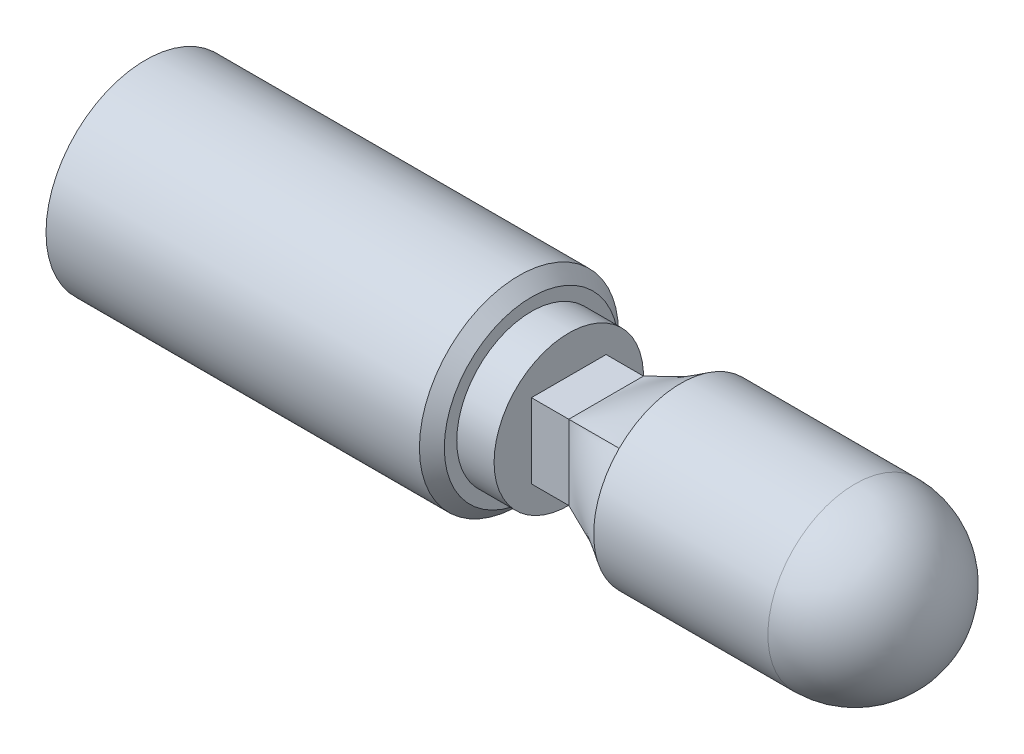
ISO-10303-21;
HEADER;
FILE_DESCRIPTION(('STEP AP214'),'2;1');
FILE_NAME('part.step','',(''),(''),'','','');
FILE_SCHEMA(('AUTOMOTIVE_DESIGN { 1 0 10303 214 1 1 1 1 }'));
ENDSEC;
DATA;
#1=APPLICATION_CONTEXT('core data for automotive mechanical design processes');
#2=APPLICATION_PROTOCOL_DEFINITION('international standard','automotive_design',2000,#1);
#3=PRODUCT_CONTEXT('',#1,'mechanical');
#4=PRODUCT('Part','Part','',(#3));
#5=PRODUCT_RELATED_PRODUCT_CATEGORY('part','',(#4));
#6=PRODUCT_DEFINITION_FORMATION('','',#4);
#7=PRODUCT_DEFINITION_CONTEXT('part definition',#1,'design');
#8=PRODUCT_DEFINITION('design','',#6,#7);
#9=PRODUCT_DEFINITION_SHAPE('','',#8);
#10=(LENGTH_UNIT() NAMED_UNIT(*) SI_UNIT(.MILLI.,.METRE.));
#11=(NAMED_UNIT(*) PLANE_ANGLE_UNIT() SI_UNIT($,.RADIAN.));
#12=(NAMED_UNIT(*) SI_UNIT($,.STERADIAN.) SOLID_ANGLE_UNIT());
#13=UNCERTAINTY_MEASURE_WITH_UNIT(LENGTH_MEASURE(1.E-05),#10,'distance_accuracy_value','');
#14=(GEOMETRIC_REPRESENTATION_CONTEXT(3) GLOBAL_UNCERTAINTY_ASSIGNED_CONTEXT((#13)) GLOBAL_UNIT_ASSIGNED_CONTEXT((#10,
#11,#12)) REPRESENTATION_CONTEXT('',''));
#15=CARTESIAN_POINT('',(0.,0.,0.));
#16=DIRECTION('',(0.,0.,1.));
#17=DIRECTION('',(1.,0.,0.));
#18=AXIS2_PLACEMENT_3D('',#15,#16,#17);
#19=CARTESIAN_POINT('',(34.,0.,0.));
#20=DIRECTION('',(-1.,0.,0.));
#21=DIRECTION('',(0.,0.,1.));
#22=AXIS2_PLACEMENT_3D('',#19,#20,#21);
#23=PLANE('',#22);
#24=CARTESIAN_POINT('',(34.,0.,0.));
#25=DIRECTION('',(-1.,0.,0.));
#26=DIRECTION('',(0.,0.,1.));
#27=AXIS2_PLACEMENT_3D('',#24,#25,#26);
#28=CIRCLE('',#27,6.);
#29=CARTESIAN_POINT('',(34.,0.,6.));
#30=VERTEX_POINT('',#29);
#31=EDGE_CURVE('E119',#30,#30,#28,.T.);
#32=ORIENTED_EDGE('',*,*,#31,.F.);
#33=EDGE_LOOP('',(#32));
#34=FACE_BOUND('',#33,.T.);
#35=DIRECTION('',(0.,1.,0.));
#36=VECTOR('',#35,1.);
#37=CARTESIAN_POINT('',(34.,-3.,-3.));
#38=LINE('',#37,#36);
#39=CARTESIAN_POINT('',(34.,-3.,-3.));
#40=VERTEX_POINT('',#39);
#41=CARTESIAN_POINT('',(34.,3.,-3.));
#42=VERTEX_POINT('',#41);
#43=EDGE_CURVE('E84',#40,#42,#38,.T.);
#44=ORIENTED_EDGE('',*,*,#43,.F.);
#45=DIRECTION('',(0.,0.,-1.));
#46=VECTOR('',#45,1.);
#47=CARTESIAN_POINT('',(34.,-3.,3.));
#48=LINE('',#47,#46);
#49=CARTESIAN_POINT('',(34.,-3.,3.));
#50=VERTEX_POINT('',#49);
#51=EDGE_CURVE('E138',#50,#40,#48,.T.);
#52=ORIENTED_EDGE('',*,*,#51,.F.);
#53=DIRECTION('',(0.,-1.,0.));
#54=VECTOR('',#53,1.);
#55=CARTESIAN_POINT('',(34.,-3.,3.));
#56=LINE('',#55,#54);
#57=CARTESIAN_POINT('',(34.,3.,3.));
#58=VERTEX_POINT('',#57);
#59=EDGE_CURVE('E108',#58,#50,#56,.T.);
#60=ORIENTED_EDGE('',*,*,#59,.F.);
#61=DIRECTION('',(0.,0.,1.));
#62=VECTOR('',#61,1.);
#63=CARTESIAN_POINT('',(34.,3.,3.));
#64=LINE('',#63,#62);
#65=EDGE_CURVE('E112',#42,#58,#64,.T.);
#66=ORIENTED_EDGE('',*,*,#65,.F.);
#67=EDGE_LOOP('',(#44,#52,#60,#66));
#68=FACE_BOUND('',#67,.T.);
#69=ADVANCED_FACE('F66',(#34,#68),#23,.F.);
#70=CARTESIAN_POINT('',(0.,0.,0.));
#71=DIRECTION('',(1.,0.,0.));
#72=DIRECTION('',(0.,0.,-1.));
#73=AXIS2_PLACEMENT_3D('',#70,#71,#72);
#74=PLANE('',#73);
#75=CARTESIAN_POINT('',(0.,0.,0.));
#76=DIRECTION('',(-1.,0.,0.));
#77=DIRECTION('',(0.,0.,1.));
#78=AXIS2_PLACEMENT_3D('',#75,#76,#77);
#79=CIRCLE('',#78,1.6);
#80=CARTESIAN_POINT('',(0.,0.,1.6));
#81=VERTEX_POINT('',#80);
#82=EDGE_CURVE('E464',#81,#81,#79,.T.);
#83=ORIENTED_EDGE('',*,*,#82,.F.);
#84=EDGE_LOOP('',(#83));
#85=FACE_BOUND('',#84,.T.);
#86=CARTESIAN_POINT('',(0.,0.,0.));
#87=DIRECTION('',(-1.,0.,0.));
#88=DIRECTION('',(0.,0.,1.));
#89=AXIS2_PLACEMENT_3D('',#86,#87,#88);
#90=CIRCLE('',#89,8.);
#91=CARTESIAN_POINT('',(0.,0.,8.));
#92=VERTEX_POINT('',#91);
#93=EDGE_CURVE('E146',#92,#92,#90,.T.);
#94=ORIENTED_EDGE('',*,*,#93,.T.);
#95=EDGE_LOOP('',(#94));
#96=FACE_BOUND('',#95,.T.);
#97=ADVANCED_FACE('F202',(#85,#96),#74,.F.);
#98=CARTESIAN_POINT('',(0.,0.,0.));
#99=DIRECTION('',(-1.,0.,0.));
#100=DIRECTION('',(0.,0.,1.));
#101=AXIS2_PLACEMENT_3D('',#98,#99,#100);
#102=CYLINDRICAL_SURFACE('',#101,8.);
#103=CARTESIAN_POINT('',(30.,0.,0.));
#104=DIRECTION('',(-1.,0.,0.));
#105=DIRECTION('',(0.,0.,1.));
#106=AXIS2_PLACEMENT_3D('',#103,#104,#105);
#107=CIRCLE('',#106,8.);
#108=CARTESIAN_POINT('',(30.,0.,8.));
#109=VERTEX_POINT('',#108);
#110=EDGE_CURVE('E76',#109,#109,#107,.T.);
#111=ORIENTED_EDGE('',*,*,#110,.T.);
#112=EDGE_LOOP('',(#111));
#113=FACE_BOUND('',#112,.T.);
#114=ORIENTED_EDGE('',*,*,#93,.F.);
#115=EDGE_LOOP('',(#114));
#116=FACE_BOUND('',#115,.T.);
#117=ADVANCED_FACE('F188',(#113,#116),#102,.T.);
#118=CARTESIAN_POINT('',(31.,8.,0.));
#119=DIRECTION('',(-1.,0.,0.));
#120=DIRECTION('',(0.,0.,1.));
#121=AXIS2_PLACEMENT_3D('',#118,#119,#120);
#122=PLANE('',#121);
#123=CARTESIAN_POINT('',(31.,0.,0.));
#124=DIRECTION('',(-1.,0.,0.));
#125=DIRECTION('',(0.,0.,1.));
#126=AXIS2_PLACEMENT_3D('',#123,#124,#125);
#127=CIRCLE('',#126,7.);
#128=CARTESIAN_POINT('',(31.,0.,7.));
#129=VERTEX_POINT('',#128);
#130=EDGE_CURVE('E12',#129,#129,#127,.F.);
#131=ORIENTED_EDGE('',*,*,#130,.T.);
#132=EDGE_LOOP('',(#131));
#133=FACE_BOUND('',#132,.T.);
#134=CARTESIAN_POINT('',(31.,0.,0.));
#135=DIRECTION('',(-1.,0.,0.));
#136=DIRECTION('',(0.,0.,1.));
#137=AXIS2_PLACEMENT_3D('',#134,#135,#136);
#138=CIRCLE('',#137,6.);
#139=CARTESIAN_POINT('',(31.,0.,6.));
#140=VERTEX_POINT('',#139);
#141=EDGE_CURVE('E143',#140,#140,#138,.T.);
#142=ORIENTED_EDGE('',*,*,#141,.T.);
#143=EDGE_LOOP('',(#142));
#144=FACE_BOUND('',#143,.T.);
#145=ADVANCED_FACE('F216',(#133,#144),#122,.F.);
#146=CARTESIAN_POINT('',(0.,0.,0.));
#147=DIRECTION('',(-1.,0.,0.));
#148=DIRECTION('',(0.,0.,1.));
#149=AXIS2_PLACEMENT_3D('',#146,#147,#148);
#150=CYLINDRICAL_SURFACE('',#149,6.);
#151=ORIENTED_EDGE('',*,*,#141,.F.);
#152=EDGE_LOOP('',(#151));
#153=FACE_BOUND('',#152,.T.);
#154=ORIENTED_EDGE('',*,*,#31,.T.);
#155=EDGE_LOOP('',(#154));
#156=FACE_BOUND('',#155,.T.);
#157=ADVANCED_FACE('F213',(#153,#156),#150,.T.);
#158=CARTESIAN_POINT('',(37.,-3.,-3.));
#159=DIRECTION('',(0.,0.,1.));
#160=DIRECTION('',(1.,0.,0.));
#161=AXIS2_PLACEMENT_3D('',#158,#159,#160);
#162=PLANE('',#161);
#163=ORIENTED_EDGE('',*,*,#43,.T.);
#164=DIRECTION('',(-1.,0.,0.));
#165=VECTOR('',#164,1.);
#166=CARTESIAN_POINT('',(37.,3.,-3.));
#167=LINE('',#166,#165);
#168=CARTESIAN_POINT('',(37.,3.,-3.));
#169=VERTEX_POINT('',#168);
#170=EDGE_CURVE('E115',#169,#42,#167,.T.);
#171=ORIENTED_EDGE('',*,*,#170,.F.);
#172=DIRECTION('',(0.,1.,0.));
#173=VECTOR('',#172,1.);
#174=CARTESIAN_POINT('',(37.,-3.,-3.));
#175=LINE('',#174,#173);
#176=CARTESIAN_POINT('',(37.,-3.,-3.));
#177=VERTEX_POINT('',#176);
#178=EDGE_CURVE('E140',#177,#169,#175,.T.);
#179=ORIENTED_EDGE('',*,*,#178,.F.);
#180=DIRECTION('',(-1.,0.,0.));
#181=VECTOR('',#180,1.);
#182=CARTESIAN_POINT('',(37.,-3.,-3.));
#183=LINE('',#182,#181);
#184=EDGE_CURVE('E125',#177,#40,#183,.T.);
#185=ORIENTED_EDGE('',*,*,#184,.T.);
#186=EDGE_LOOP('',(#163,#171,#179,#185));
#187=FACE_BOUND('',#186,.T.);
#188=ADVANCED_FACE('F123',(#187),#162,.F.);
#189=CARTESIAN_POINT('',(37.,3.,3.));
#190=DIRECTION('',(0.,-1.,0.));
#191=DIRECTION('',(0.,0.,-1.));
#192=AXIS2_PLACEMENT_3D('',#189,#190,#191);
#193=PLANE('',#192);
#194=ORIENTED_EDGE('',*,*,#65,.T.);
#195=DIRECTION('',(-1.,0.,0.));
#196=VECTOR('',#195,1.);
#197=CARTESIAN_POINT('',(37.,3.,3.));
#198=LINE('',#197,#196);
#199=CARTESIAN_POINT('',(37.,3.,3.));
#200=VERTEX_POINT('',#199);
#201=EDGE_CURVE('E120',#200,#58,#198,.T.);
#202=ORIENTED_EDGE('',*,*,#201,.F.);
#203=DIRECTION('',(0.,0.,-1.));
#204=VECTOR('',#203,1.);
#205=CARTESIAN_POINT('',(37.,3.,3.));
#206=LINE('',#205,#204);
#207=EDGE_CURVE('E103',#169,#200,#206,.F.);
#208=ORIENTED_EDGE('',*,*,#207,.F.);
#209=ORIENTED_EDGE('',*,*,#170,.T.);
#210=EDGE_LOOP('',(#194,#202,#208,#209));
#211=FACE_BOUND('',#210,.T.);
#212=ADVANCED_FACE('F116',(#211),#193,.F.);
#213=CARTESIAN_POINT('',(37.,-3.,3.));
#214=DIRECTION('',(0.,0.,-1.));
#215=DIRECTION('',(-1.,0.,0.));
#216=AXIS2_PLACEMENT_3D('',#213,#214,#215);
#217=PLANE('',#216);
#218=ORIENTED_EDGE('',*,*,#59,.T.);
#219=DIRECTION('',(-1.,0.,0.));
#220=VECTOR('',#219,1.);
#221=CARTESIAN_POINT('',(37.,-3.,3.));
#222=LINE('',#221,#220);
#223=CARTESIAN_POINT('',(37.,-3.,3.));
#224=VERTEX_POINT('',#223);
#225=EDGE_CURVE('E150',#224,#50,#222,.T.);
#226=ORIENTED_EDGE('',*,*,#225,.F.);
#227=DIRECTION('',(0.,1.,0.));
#228=VECTOR('',#227,1.);
#229=CARTESIAN_POINT('',(37.,-3.,3.));
#230=LINE('',#229,#228);
#231=EDGE_CURVE('E158',#200,#224,#230,.F.);
#232=ORIENTED_EDGE('',*,*,#231,.F.);
#233=ORIENTED_EDGE('',*,*,#201,.T.);
#234=EDGE_LOOP('',(#218,#226,#232,#233));
#235=FACE_BOUND('',#234,.T.);
#236=ADVANCED_FACE('F246',(#235),#217,.F.);
#237=CARTESIAN_POINT('',(37.,-3.,3.));
#238=DIRECTION('',(0.,1.,0.));
#239=DIRECTION('',(0.,0.,1.));
#240=AXIS2_PLACEMENT_3D('',#237,#238,#239);
#241=PLANE('',#240);
#242=ORIENTED_EDGE('',*,*,#51,.T.);
#243=ORIENTED_EDGE('',*,*,#184,.F.);
#244=DIRECTION('',(0.,0.,1.));
#245=VECTOR('',#244,1.);
#246=CARTESIAN_POINT('',(37.,-3.,3.));
#247=LINE('',#246,#245);
#248=EDGE_CURVE('E151',#224,#177,#247,.F.);
#249=ORIENTED_EDGE('',*,*,#248,.F.);
#250=ORIENTED_EDGE('',*,*,#225,.T.);
#251=EDGE_LOOP('',(#242,#243,#249,#250));
#252=FACE_BOUND('',#251,.T.);
#253=ADVANCED_FACE('F252',(#252),#241,.F.);
#254=CARTESIAN_POINT('',(43.,4.94974746830583,-4.94974746830583));
#255=CARTESIAN_POINT('',(37.,3.,-3.));
#256=CARTESIAN_POINT('',(43.,4.65808080163917,-5.2414141349725));
#257=CARTESIAN_POINT('',(37.,2.75,-3.));
#258=CARTESIAN_POINT('',(43.,4.32957833687793,-5.51805960745283));
#259=CARTESIAN_POINT('',(37.,2.5,-3.));
#260=CARTESIAN_POINT('',(43.,3.60330586290059,-6.01750922433454));
#261=CARTESIAN_POINT('',(37.,2.,-3.));
#262=CARTESIAN_POINT('',(43.,3.20549876475148,-6.240151659734));
#263=CARTESIAN_POINT('',(37.,1.75,-3.));
#264=CARTESIAN_POINT('',(43.,2.35498410023551,-6.60823463225559));
#265=CARTESIAN_POINT('',(37.,1.25,-3.));
#266=CARTESIAN_POINT('',(43.,1.9023431213879,-6.75349475440457));
#267=CARTESIAN_POINT('',(37.,1.,-3.));
#268=CARTESIAN_POINT('',(43.,0.966389520987096,-6.9494382537719));
#269=CARTESIAN_POINT('',(37.,0.499999999999999,-3.));
#270=CARTESIAN_POINT('',(43.,0.483249156101944,-7.));
#271=CARTESIAN_POINT('',(37.,0.249999999999999,-3.));
#272=CARTESIAN_POINT('',(43.,-0.483249156101945,-7.));
#273=CARTESIAN_POINT('',(37.,-0.250000000000001,-3.));
#274=CARTESIAN_POINT('',(43.,-0.966389520987098,-6.9494382537719));
#275=CARTESIAN_POINT('',(37.,-0.500000000000001,-3.));
#276=CARTESIAN_POINT('',(43.,-1.9023431213879,-6.75349475440457));
#277=CARTESIAN_POINT('',(37.,-1.,-3.));
#278=CARTESIAN_POINT('',(43.,-2.35498410023551,-6.60823463225559));
#279=CARTESIAN_POINT('',(37.,-1.25,-3.));
#280=CARTESIAN_POINT('',(43.,-3.20549876475148,-6.240151659734));
#281=CARTESIAN_POINT('',(37.,-1.75,-3.));
#282=CARTESIAN_POINT('',(43.,-3.6033058629006,-6.01750922433455));
#283=CARTESIAN_POINT('',(37.,-2.,-3.));
#284=CARTESIAN_POINT('',(43.,-4.32957833687792,-5.51805960745283));
#285=CARTESIAN_POINT('',(37.,-2.5,-3.));
#286=CARTESIAN_POINT('',(43.,-4.65808080163917,-5.2414141349725));
#287=CARTESIAN_POINT('',(37.,-2.75,-3.));
#288=CARTESIAN_POINT('',(43.,-4.94974746830583,-4.94974746830583));
#289=CARTESIAN_POINT('',(37.,-3.,-3.));
#290=B_SPLINE_SURFACE_WITH_KNOTS('',3,1,((#254,#255),(#256,#257),(#258,#259),(#260,#261),(#262,
#263),(#264,#265),(#266,#267),(#268,#269),(#270,#271),(#272,#273),(#274,#275),(#276,#277),(#278,
#279),(#280,#281),(#282,#283),(#284,#285),(#286,#287),(#288,#289)),.UNSPECIFIED.,.F.,.F.,.F.,(4,
2,2,2,2,2,2,2,4),(2,2),(0.,0.125,0.25,0.375,0.5,0.625,0.75,0.875,1.),(0.,1.),.UNSPECIFIED.);
#291=CARTESIAN_POINT('',(43.,0.,0.));
#292=DIRECTION('',(1.,0.,0.));
#293=DIRECTION('',(0.,0.,-1.));
#294=AXIS2_PLACEMENT_3D('',#291,#292,#293);
#295=CIRCLE('',#294,7.);
#296=CARTESIAN_POINT('',(43.,-4.94974746830583,-4.94974746830583));
#297=VERTEX_POINT('',#296);
#298=CARTESIAN_POINT('',(43.,4.94974746830583,-4.94974746830583));
#299=VERTEX_POINT('',#298);
#300=EDGE_CURVE('E184',#297,#299,#295,.T.);
#301=DIRECTION('',(-0.90864222257543,0.295270478843705,0.295270478843705));
#302=VECTOR('',#301,1.);
#303=CARTESIAN_POINT('',(40.,-3.97487373415292,-3.97487373415292));
#304=LINE('',#303,#302);
#305=EDGE_CURVE('E392',#297,#177,#304,.T.);
#306=DIRECTION('',(0.90864222257543,0.295270478843705,-0.295270478843705));
#307=VECTOR('',#306,1.);
#308=CARTESIAN_POINT('',(40.,3.97487373415292,-3.97487373415292));
#309=LINE('',#308,#307);
#310=EDGE_CURVE('E183',#169,#299,#309,.T.);
#311=ORIENTED_EDGE('',*,*,#300,.F.);
#312=ORIENTED_EDGE('',*,*,#305,.T.);
#313=ORIENTED_EDGE('',*,*,#178,.T.);
#314=ORIENTED_EDGE('',*,*,#310,.T.);
#315=EDGE_LOOP('',(#311,#312,#313,#314));
#316=FACE_BOUND('',#315,.T.);
#317=ADVANCED_FACE('F260',(#316),#290,.T.);
#318=CARTESIAN_POINT('',(43.,-4.94974746830583,-4.94974746830583));
#319=CARTESIAN_POINT('',(37.,-3.,-3.));
#320=CARTESIAN_POINT('',(43.,-5.2414141349725,-4.65808080163917));
#321=CARTESIAN_POINT('',(37.,-3.,-2.75));
#322=CARTESIAN_POINT('',(43.,-5.51805960745283,-4.32957833687792));
#323=CARTESIAN_POINT('',(37.,-3.,-2.5));
#324=CARTESIAN_POINT('',(43.,-6.01750922433454,-3.60330586290059));
#325=CARTESIAN_POINT('',(37.,-3.,-2.));
#326=CARTESIAN_POINT('',(43.,-6.240151659734,-3.20549876475148));
#327=CARTESIAN_POINT('',(37.,-3.,-1.75));
#328=CARTESIAN_POINT('',(43.,-6.60823463225559,-2.35498410023551));
#329=CARTESIAN_POINT('',(37.,-3.,-1.25));
#330=CARTESIAN_POINT('',(43.,-6.75349475440457,-1.9023431213879));
#331=CARTESIAN_POINT('',(37.,-3.,-0.999999999999999));
#332=CARTESIAN_POINT('',(43.,-6.9494382537719,-0.966389520987095));
#333=CARTESIAN_POINT('',(37.,-3.,-0.499999999999999));
#334=CARTESIAN_POINT('',(43.,-7.,-0.483249156101943));
#335=CARTESIAN_POINT('',(37.,-3.,-0.249999999999998));
#336=CARTESIAN_POINT('',(43.,-7.,0.483249156101946));
#337=CARTESIAN_POINT('',(37.,-3.,0.250000000000002));
#338=CARTESIAN_POINT('',(43.,-6.9494382537719,0.966389520987099));
#339=CARTESIAN_POINT('',(37.,-3.,0.500000000000002));
#340=CARTESIAN_POINT('',(43.,-6.75349475440457,1.9023431213879));
#341=CARTESIAN_POINT('',(37.,-3.,1.));
#342=CARTESIAN_POINT('',(43.,-6.60823463225559,2.35498410023551));
#343=CARTESIAN_POINT('',(37.,-3.,1.25));
#344=CARTESIAN_POINT('',(43.,-6.240151659734,3.20549876475148));
#345=CARTESIAN_POINT('',(37.,-3.,1.75));
#346=CARTESIAN_POINT('',(43.,-6.01750922433455,3.6033058629006));
#347=CARTESIAN_POINT('',(37.,-3.,2.));
#348=CARTESIAN_POINT('',(43.,-5.51805960745283,4.32957833687792));
#349=CARTESIAN_POINT('',(37.,-3.,2.5));
#350=CARTESIAN_POINT('',(43.,-5.2414141349725,4.65808080163917));
#351=CARTESIAN_POINT('',(37.,-3.,2.75));
#352=CARTESIAN_POINT('',(43.,-4.94974746830583,4.94974746830583));
#353=CARTESIAN_POINT('',(37.,-3.,3.));
#354=B_SPLINE_SURFACE_WITH_KNOTS('',3,1,((#318,#319),(#320,#321),(#322,#323),(#324,#325),(#326,
#327),(#328,#329),(#330,#331),(#332,#333),(#334,#335),(#336,#337),(#338,#339),(#340,#341),(#342,
#343),(#344,#345),(#346,#347),(#348,#349),(#350,#351),(#352,#353)),.UNSPECIFIED.,.F.,.F.,.F.,(4,
2,2,2,2,2,2,2,4),(2,2),(0.,0.125,0.25,0.375,0.5,0.625,0.75,0.875,1.),(0.,1.),.UNSPECIFIED.);
#355=CARTESIAN_POINT('',(43.,-4.94974746830583,4.94974746830583));
#356=VERTEX_POINT('',#355);
#357=EDGE_CURVE('E181',#356,#297,#295,.T.);
#358=DIRECTION('',(-0.90864222257543,0.295270478843705,-0.295270478843705));
#359=VECTOR('',#358,1.);
#360=CARTESIAN_POINT('',(40.,-3.97487373415292,3.97487373415292));
#361=LINE('',#360,#359);
#362=EDGE_CURVE('E129',#356,#224,#361,.T.);
#363=ORIENTED_EDGE('',*,*,#357,.F.);
#364=ORIENTED_EDGE('',*,*,#362,.T.);
#365=ORIENTED_EDGE('',*,*,#248,.T.);
#366=ORIENTED_EDGE('',*,*,#305,.F.);
#367=EDGE_LOOP('',(#363,#364,#365,#366));
#368=FACE_BOUND('',#367,.T.);
#369=ADVANCED_FACE('F268',(#368),#354,.T.);
#370=CARTESIAN_POINT('',(43.,4.94974746830583,4.94974746830583));
#371=CARTESIAN_POINT('',(37.,3.,3.));
#372=CARTESIAN_POINT('',(43.,5.2414141349725,4.65808080163917));
#373=CARTESIAN_POINT('',(37.,3.,2.75));
#374=CARTESIAN_POINT('',(43.,5.51805960745283,4.32957833687792));
#375=CARTESIAN_POINT('',(37.,3.,2.5));
#376=CARTESIAN_POINT('',(43.,6.01750922433454,3.60330586290059));
#377=CARTESIAN_POINT('',(37.,3.,2.));
#378=CARTESIAN_POINT('',(43.,6.240151659734,3.20549876475148));
#379=CARTESIAN_POINT('',(37.,3.,1.75));
#380=CARTESIAN_POINT('',(43.,6.6082346322556,2.35498410023551));
#381=CARTESIAN_POINT('',(37.,3.,1.25));
#382=CARTESIAN_POINT('',(43.,6.75349475440457,1.9023431213879));
#383=CARTESIAN_POINT('',(37.,3.,1.));
#384=CARTESIAN_POINT('',(43.,6.9494382537719,0.966389520987097));
#385=CARTESIAN_POINT('',(37.,3.,0.5));
#386=CARTESIAN_POINT('',(43.,7.,0.483249156101944));
#387=CARTESIAN_POINT('',(37.,3.,0.25));
#388=CARTESIAN_POINT('',(43.,7.,-0.483249156101944));
#389=CARTESIAN_POINT('',(37.,3.,-0.25));
#390=CARTESIAN_POINT('',(43.,6.9494382537719,-0.966389520987098));
#391=CARTESIAN_POINT('',(37.,3.,-0.5));
#392=CARTESIAN_POINT('',(43.,6.75349475440457,-1.9023431213879));
#393=CARTESIAN_POINT('',(37.,3.,-1.));
#394=CARTESIAN_POINT('',(43.,6.60823463225559,-2.35498410023551));
#395=CARTESIAN_POINT('',(37.,3.,-1.25));
#396=CARTESIAN_POINT('',(43.,6.240151659734,-3.20549876475148));
#397=CARTESIAN_POINT('',(37.,3.,-1.75));
#398=CARTESIAN_POINT('',(43.,6.01750922433455,-3.60330586290059));
#399=CARTESIAN_POINT('',(37.,3.,-2.));
#400=CARTESIAN_POINT('',(43.,5.51805960745283,-4.32957833687793));
#401=CARTESIAN_POINT('',(37.,3.,-2.5));
#402=CARTESIAN_POINT('',(43.,5.2414141349725,-4.65808080163917));
#403=CARTESIAN_POINT('',(37.,3.,-2.75));
#404=CARTESIAN_POINT('',(43.,4.94974746830583,-4.94974746830583));
#405=CARTESIAN_POINT('',(37.,3.,-3.));
#406=B_SPLINE_SURFACE_WITH_KNOTS('',3,1,((#370,#371),(#372,#373),(#374,#375),(#376,#377),(#378,
#379),(#380,#381),(#382,#383),(#384,#385),(#386,#387),(#388,#389),(#390,#391),(#392,#393),(#394,
#395),(#396,#397),(#398,#399),(#400,#401),(#402,#403),(#404,#405)),.UNSPECIFIED.,.F.,.F.,.F.,(4,
2,2,2,2,2,2,2,4),(2,2),(0.,0.125,0.25,0.375,0.5,0.625,0.75,0.875,1.),(0.,1.),.UNSPECIFIED.);
#407=CARTESIAN_POINT('',(43.,4.94974746830583,4.94974746830583));
#408=VERTEX_POINT('',#407);
#409=EDGE_CURVE('E166',#299,#408,#295,.T.);
#410=DIRECTION('',(-0.90864222257543,-0.295270478843705,-0.295270478843705));
#411=VECTOR('',#410,1.);
#412=CARTESIAN_POINT('',(40.,3.97487373415292,3.97487373415292));
#413=LINE('',#412,#411);
#414=EDGE_CURVE('E126',#408,#200,#413,.T.);
#415=ORIENTED_EDGE('',*,*,#409,.F.);
#416=ORIENTED_EDGE('',*,*,#310,.F.);
#417=ORIENTED_EDGE('',*,*,#207,.T.);
#418=ORIENTED_EDGE('',*,*,#414,.F.);
#419=EDGE_LOOP('',(#415,#416,#417,#418));
#420=FACE_BOUND('',#419,.T.);
#421=ADVANCED_FACE('F276',(#420),#406,.T.);
#422=CARTESIAN_POINT('',(43.,-4.94974746830583,4.94974746830583));
#423=CARTESIAN_POINT('',(37.,-3.,3.));
#424=CARTESIAN_POINT('',(43.,-4.65808080163917,5.2414141349725));
#425=CARTESIAN_POINT('',(37.,-2.75,3.));
#426=CARTESIAN_POINT('',(43.,-4.32957833687793,5.51805960745283));
#427=CARTESIAN_POINT('',(37.,-2.5,3.));
#428=CARTESIAN_POINT('',(43.,-3.60330586290059,6.01750922433455));
#429=CARTESIAN_POINT('',(37.,-2.,3.));
#430=CARTESIAN_POINT('',(43.,-3.20549876475148,6.240151659734));
#431=CARTESIAN_POINT('',(37.,-1.74999999999999,3.));
#432=CARTESIAN_POINT('',(43.,-2.35498410023551,6.60823463225559));
#433=CARTESIAN_POINT('',(37.,-1.24999999999999,3.));
#434=CARTESIAN_POINT('',(43.,-1.9023431213879,6.75349475440457));
#435=CARTESIAN_POINT('',(37.,-0.999999999999993,3.));
#436=CARTESIAN_POINT('',(43.,-0.966389520987096,6.9494382537719));
#437=CARTESIAN_POINT('',(37.,-0.499999999999992,3.));
#438=CARTESIAN_POINT('',(43.,-0.483249156101943,7.));
#439=CARTESIAN_POINT('',(37.,-0.249999999999993,3.));
#440=CARTESIAN_POINT('',(43.,0.483249156101945,7.));
#441=CARTESIAN_POINT('',(37.,0.250000000000007,3.));
#442=CARTESIAN_POINT('',(43.,0.966389520987098,6.9494382537719));
#443=CARTESIAN_POINT('',(37.,0.500000000000007,3.));
#444=CARTESIAN_POINT('',(43.,1.9023431213879,6.75349475440457));
#445=CARTESIAN_POINT('',(37.,1.00000000000001,3.));
#446=CARTESIAN_POINT('',(43.,2.35498410023551,6.60823463225559));
#447=CARTESIAN_POINT('',(37.,1.25000000000001,3.));
#448=CARTESIAN_POINT('',(43.,3.20549876475148,6.240151659734));
#449=CARTESIAN_POINT('',(37.,1.75000000000001,3.));
#450=CARTESIAN_POINT('',(43.,3.60330586290059,6.01750922433454));
#451=CARTESIAN_POINT('',(37.,2.,3.));
#452=CARTESIAN_POINT('',(43.,4.32957833687793,5.51805960745283));
#453=CARTESIAN_POINT('',(37.,2.5,3.));
#454=CARTESIAN_POINT('',(43.,4.65808080163917,5.2414141349725));
#455=CARTESIAN_POINT('',(37.,2.75,3.));
#456=CARTESIAN_POINT('',(43.,4.94974746830583,4.94974746830583));
#457=CARTESIAN_POINT('',(37.,3.,3.));
#458=B_SPLINE_SURFACE_WITH_KNOTS('',3,1,((#422,#423),(#424,#425),(#426,#427),(#428,#429),(#430,
#431),(#432,#433),(#434,#435),(#436,#437),(#438,#439),(#440,#441),(#442,#443),(#444,#445),(#446,
#447),(#448,#449),(#450,#451),(#452,#453),(#454,#455),(#456,#457)),.UNSPECIFIED.,.F.,.F.,.F.,(4,
2,2,2,2,2,2,2,4),(2,2),(0.,0.125,0.25,0.375,0.5,0.625,0.75,0.875,1.),(0.,1.),.UNSPECIFIED.);
#459=EDGE_CURVE('E162',#408,#356,#295,.T.);
#460=ORIENTED_EDGE('',*,*,#459,.F.);
#461=ORIENTED_EDGE('',*,*,#414,.T.);
#462=ORIENTED_EDGE('',*,*,#231,.T.);
#463=ORIENTED_EDGE('',*,*,#362,.F.);
#464=EDGE_LOOP('',(#460,#461,#462,#463));
#465=FACE_BOUND('',#464,.T.);
#466=ADVANCED_FACE('F284',(#465),#458,.T.);
#467=CARTESIAN_POINT('',(57.,0.,0.));
#468=DIRECTION('',(-1.,0.,0.));
#469=DIRECTION('',(0.,0.,1.));
#470=AXIS2_PLACEMENT_3D('',#467,#468,#469);
#471=CYLINDRICAL_SURFACE('',#470,7.);
#472=CARTESIAN_POINT('',(57.,0.,0.));
#473=DIRECTION('',(1.,0.,0.));
#474=DIRECTION('',(0.,0.,-1.));
#475=AXIS2_PLACEMENT_3D('',#472,#473,#474);
#476=CIRCLE('',#475,7.);
#477=CARTESIAN_POINT('',(57.,0.,-7.));
#478=VERTEX_POINT('',#477);
#479=EDGE_CURVE('E167',#478,#478,#476,.T.);
#480=ORIENTED_EDGE('',*,*,#479,.F.);
#481=EDGE_LOOP('',(#480));
#482=FACE_BOUND('',#481,.T.);
#483=ORIENTED_EDGE('',*,*,#409,.T.);
#484=ORIENTED_EDGE('',*,*,#459,.T.);
#485=ORIENTED_EDGE('',*,*,#357,.T.);
#486=ORIENTED_EDGE('',*,*,#300,.T.);
#487=EDGE_LOOP('',(#483,#484,#485,#486));
#488=FACE_BOUND('',#487,.T.);
#489=ADVANCED_FACE('F291',(#482,#488),#471,.T.);
#490=CARTESIAN_POINT('',(57.,0.,0.));
#491=DIRECTION('',(-1.,0.,0.));
#492=DIRECTION('',(0.,1.,0.));
#493=AXIS2_PLACEMENT_3D('',#490,#491,#492);
#494=SPHERICAL_SURFACE('',#493,7.00000000000001);
#495=ORIENTED_EDGE('',*,*,#479,.T.);
#496=EDGE_LOOP('',(#495));
#497=FACE_BOUND('',#496,.T.);
#498=ADVANCED_FACE('F299',(#497),#494,.T.);
#499=CARTESIAN_POINT('',(6.,0.,0.));
#500=DIRECTION('',(-1.,0.,0.));
#501=DIRECTION('',(0.,0.,1.));
#502=AXIS2_PLACEMENT_3D('',#499,#500,#501);
#503=CYLINDRICAL_SURFACE('',#502,1.6);
#504=CARTESIAN_POINT('',(6.,0.,0.));
#505=DIRECTION('',(-1.,0.,0.));
#506=DIRECTION('',(0.,0.,1.));
#507=AXIS2_PLACEMENT_3D('',#504,#505,#506);
#508=CIRCLE('',#507,1.6);
#509=CARTESIAN_POINT('',(6.,0.,1.6));
#510=VERTEX_POINT('',#509);
#511=EDGE_CURVE('E463',#510,#510,#508,.T.);
#512=ORIENTED_EDGE('',*,*,#511,.F.);
#513=EDGE_LOOP('',(#512));
#514=FACE_BOUND('',#513,.T.);
#515=ORIENTED_EDGE('',*,*,#82,.T.);
#516=EDGE_LOOP('',(#515));
#517=FACE_BOUND('',#516,.T.);
#518=ADVANCED_FACE('F197',(#514,#517),#503,.F.);
#519=CARTESIAN_POINT('',(6.,0.,0.));
#520=DIRECTION('',(-1.,0.,0.));
#521=DIRECTION('',(0.,0.,1.));
#522=AXIS2_PLACEMENT_3D('',#519,#520,#521);
#523=PLANE('',#522);
#524=ORIENTED_EDGE('',*,*,#511,.T.);
#525=EDGE_LOOP('',(#524));
#526=FACE_BOUND('',#525,.T.);
#527=ADVANCED_FACE('F192',(#526),#523,.T.);
#528=CARTESIAN_POINT('',(30.,0.,0.));
#529=DIRECTION('',(-1.,0.,0.));
#530=DIRECTION('',(0.,0.,1.));
#531=AXIS2_PLACEMENT_3D('',#528,#529,#530);
#532=CONICAL_SURFACE('',#531,8.,0.785398163397448);
#533=ORIENTED_EDGE('',*,*,#130,.F.);
#534=EDGE_LOOP('',(#533));
#535=FACE_BOUND('',#534,.T.);
#536=ORIENTED_EDGE('',*,*,#110,.F.);
#537=EDGE_LOOP('',(#536));
#538=FACE_BOUND('',#537,.T.);
#539=ADVANCED_FACE('F69',(#535,#538),#532,.T.);
#540=CLOSED_SHELL('',(#69,#97,#117,#145,#157,#188,#212,#236,#253,#317,#369,#421,#466,#489,#498,
#518,#527,#539));
#541=MANIFOLD_SOLID_BREP('B2',#540);
#542=ADVANCED_BREP_SHAPE_REPRESENTATION('',(#18,#541),#14);
#543=SHAPE_DEFINITION_REPRESENTATION(#9,#542);
ENDSEC;
END-ISO-10303-21;
